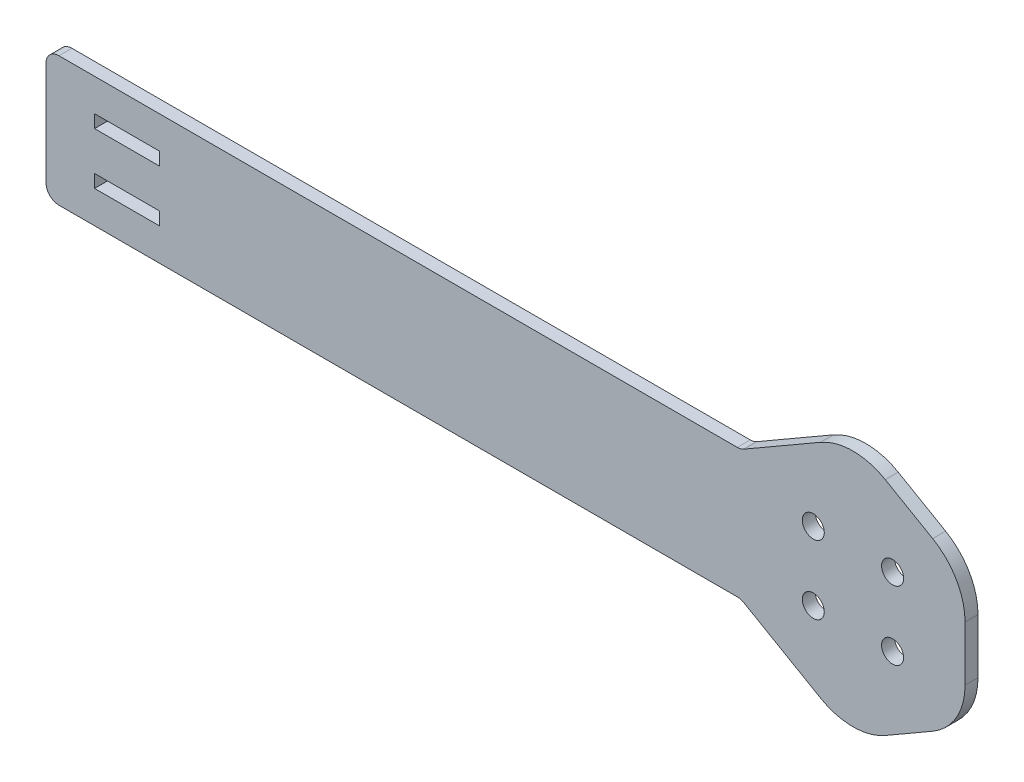
ISO-10303-21;
HEADER;
FILE_DESCRIPTION(('STEP AP214'),'2;1');
FILE_NAME('part.step','',(''),(''),'','','');
FILE_SCHEMA(('AUTOMOTIVE_DESIGN { 1 0 10303 214 1 1 1 1 }'));
ENDSEC;
DATA;
#1=APPLICATION_CONTEXT('core data for automotive mechanical design processes');
#2=APPLICATION_PROTOCOL_DEFINITION('international standard','automotive_design',2000,#1);
#3=PRODUCT_CONTEXT('',#1,'mechanical');
#4=PRODUCT('Part','Part','',(#3));
#5=PRODUCT_RELATED_PRODUCT_CATEGORY('part','',(#4));
#6=PRODUCT_DEFINITION_FORMATION('','',#4);
#7=PRODUCT_DEFINITION_CONTEXT('part definition',#1,'design');
#8=PRODUCT_DEFINITION('design','',#6,#7);
#9=PRODUCT_DEFINITION_SHAPE('','',#8);
#10=(LENGTH_UNIT() NAMED_UNIT(*) SI_UNIT(.MILLI.,.METRE.));
#11=(NAMED_UNIT(*) PLANE_ANGLE_UNIT() SI_UNIT($,.RADIAN.));
#12=(NAMED_UNIT(*) SI_UNIT($,.STERADIAN.) SOLID_ANGLE_UNIT());
#13=UNCERTAINTY_MEASURE_WITH_UNIT(LENGTH_MEASURE(1.E-05),#10,'distance_accuracy_value','');
#14=(GEOMETRIC_REPRESENTATION_CONTEXT(3) GLOBAL_UNCERTAINTY_ASSIGNED_CONTEXT((#13)) GLOBAL_UNIT_ASSIGNED_CONTEXT((#10,
#11,#12)) REPRESENTATION_CONTEXT('',''));
#15=CARTESIAN_POINT('',(0.,0.,0.));
#16=DIRECTION('',(0.,0.,1.));
#17=DIRECTION('',(1.,0.,0.));
#18=AXIS2_PLACEMENT_3D('',#15,#16,#17);
#19=CARTESIAN_POINT('',(-1.16313209064248E-12,-15.0000000000004,2.));
#20=DIRECTION('',(0.,1.,0.));
#21=DIRECTION('',(-1.,0.,0.));
#22=AXIS2_PLACEMENT_3D('',#19,#20,#21);
#23=PLANE('',#22);
#24=DIRECTION('',(1.,0.,0.));
#25=VECTOR('',#24,1.);
#26=CARTESIAN_POINT('',(-1.16313209064248E-12,-15.0000000000004,0.));
#27=LINE('',#26,#25);
#28=CARTESIAN_POINT('',(7.5,-15.000000000001,0.));
#29=VERTEX_POINT('',#28);
#30=CARTESIAN_POINT('',(17.5,-15.0000000000017,0.));
#31=VERTEX_POINT('',#30);
#32=EDGE_CURVE('E275',#29,#31,#27,.T.);
#33=ORIENTED_EDGE('',*,*,#32,.T.);
#34=DIRECTION('',(0.,0.,-1.));
#35=VECTOR('',#34,1.);
#36=CARTESIAN_POINT('',(17.5,-15.0000000000017,2.));
#37=LINE('',#36,#35);
#38=CARTESIAN_POINT('',(17.5,-15.0000000000017,2.));
#39=VERTEX_POINT('',#38);
#40=EDGE_CURVE('E305',#39,#31,#37,.T.);
#41=ORIENTED_EDGE('',*,*,#40,.F.);
#42=DIRECTION('',(1.,0.,0.));
#43=VECTOR('',#42,1.);
#44=CARTESIAN_POINT('',(-1.16313209064248E-12,-15.0000000000004,2.));
#45=LINE('',#44,#43);
#46=CARTESIAN_POINT('',(7.5,-15.000000000001,2.));
#47=VERTEX_POINT('',#46);
#48=EDGE_CURVE('E224',#47,#39,#45,.T.);
#49=ORIENTED_EDGE('',*,*,#48,.F.);
#50=DIRECTION('',(0.,0.,-1.));
#51=VECTOR('',#50,1.);
#52=CARTESIAN_POINT('',(7.5,-15.000000000001,2.));
#53=LINE('',#52,#51);
#54=EDGE_CURVE('E203',#47,#29,#53,.T.);
#55=ORIENTED_EDGE('',*,*,#54,.T.);
#56=EDGE_LOOP('',(#33,#41,#49,#55));
#57=FACE_BOUND('',#56,.T.);
#58=ADVANCED_FACE('F34',(#57),#23,.F.);
#59=CARTESIAN_POINT('',(17.5,0.,2.));
#60=DIRECTION('',(1.,0.,0.));
#61=DIRECTION('',(0.,0.,-1.));
#62=AXIS2_PLACEMENT_3D('',#59,#60,#61);
#63=PLANE('',#62);
#64=DIRECTION('',(0.,-1.,0.));
#65=VECTOR('',#64,1.);
#66=CARTESIAN_POINT('',(17.5,0.,0.));
#67=LINE('',#66,#65);
#68=CARTESIAN_POINT('',(17.5,-17.0000000000017,0.));
#69=VERTEX_POINT('',#68);
#70=EDGE_CURVE('E278',#31,#69,#67,.T.);
#71=ORIENTED_EDGE('',*,*,#70,.T.);
#72=DIRECTION('',(0.,0.,-1.));
#73=VECTOR('',#72,1.);
#74=CARTESIAN_POINT('',(17.5,-17.0000000000017,2.));
#75=LINE('',#74,#73);
#76=CARTESIAN_POINT('',(17.5,-17.0000000000017,2.));
#77=VERTEX_POINT('',#76);
#78=EDGE_CURVE('E303',#77,#69,#75,.T.);
#79=ORIENTED_EDGE('',*,*,#78,.F.);
#80=DIRECTION('',(0.,-1.,0.));
#81=VECTOR('',#80,1.);
#82=CARTESIAN_POINT('',(17.5,0.,2.));
#83=LINE('',#82,#81);
#84=EDGE_CURVE('E227',#39,#77,#83,.T.);
#85=ORIENTED_EDGE('',*,*,#84,.F.);
#86=ORIENTED_EDGE('',*,*,#40,.T.);
#87=EDGE_LOOP('',(#71,#79,#85,#86));
#88=FACE_BOUND('',#87,.T.);
#89=ADVANCED_FACE('F444',(#88),#63,.F.);
#90=CARTESIAN_POINT('',(0.,-17.0000000000018,2.));
#91=DIRECTION('',(0.,1.,0.));
#92=DIRECTION('',(-1.,0.,0.));
#93=AXIS2_PLACEMENT_3D('',#90,#91,#92);
#94=PLANE('',#93);
#95=DIRECTION('',(1.,0.,0.));
#96=VECTOR('',#95,1.);
#97=CARTESIAN_POINT('',(0.,-17.0000000000018,0.));
#98=LINE('',#97,#96);
#99=CARTESIAN_POINT('',(7.5,-17.0000000000017,0.));
#100=VERTEX_POINT('',#99);
#101=EDGE_CURVE('E281',#100,#69,#98,.T.);
#102=ORIENTED_EDGE('',*,*,#101,.F.);
#103=DIRECTION('',(0.,0.,-1.));
#104=VECTOR('',#103,1.);
#105=CARTESIAN_POINT('',(7.5,-17.0000000000017,2.));
#106=LINE('',#105,#104);
#107=CARTESIAN_POINT('',(7.5,-17.0000000000017,2.));
#108=VERTEX_POINT('',#107);
#109=EDGE_CURVE('E301',#108,#100,#106,.T.);
#110=ORIENTED_EDGE('',*,*,#109,.F.);
#111=DIRECTION('',(1.,0.,0.));
#112=VECTOR('',#111,1.);
#113=CARTESIAN_POINT('',(0.,-17.0000000000018,2.));
#114=LINE('',#113,#112);
#115=EDGE_CURVE('E229',#108,#77,#114,.T.);
#116=ORIENTED_EDGE('',*,*,#115,.T.);
#117=ORIENTED_EDGE('',*,*,#78,.T.);
#118=EDGE_LOOP('',(#102,#110,#116,#117));
#119=FACE_BOUND('',#118,.T.);
#120=ADVANCED_FACE('F450',(#119),#94,.T.);
#121=CARTESIAN_POINT('',(17.5,0.,2.));
#122=DIRECTION('',(-1.,0.,0.));
#123=DIRECTION('',(0.,0.,1.));
#124=AXIS2_PLACEMENT_3D('',#121,#122,#123);
#125=PLANE('',#124);
#126=DIRECTION('',(0.,1.,0.));
#127=VECTOR('',#126,1.);
#128=CARTESIAN_POINT('',(17.5,0.,0.));
#129=LINE('',#128,#127);
#130=CARTESIAN_POINT('',(17.5,-25.0000000000017,0.));
#131=VERTEX_POINT('',#130);
#132=CARTESIAN_POINT('',(17.5,-23.0000000000017,0.));
#133=VERTEX_POINT('',#132);
#134=EDGE_CURVE('E198',#131,#133,#129,.T.);
#135=ORIENTED_EDGE('',*,*,#134,.F.);
#136=DIRECTION('',(0.,0.,-1.));
#137=VECTOR('',#136,1.);
#138=CARTESIAN_POINT('',(17.5,-25.0000000000017,2.));
#139=LINE('',#138,#137);
#140=CARTESIAN_POINT('',(17.5,-25.0000000000017,2.));
#141=VERTEX_POINT('',#140);
#142=EDGE_CURVE('E193',#141,#131,#139,.T.);
#143=ORIENTED_EDGE('',*,*,#142,.F.);
#144=DIRECTION('',(0.,1.,0.));
#145=VECTOR('',#144,1.);
#146=CARTESIAN_POINT('',(17.5,0.,2.));
#147=LINE('',#146,#145);
#148=CARTESIAN_POINT('',(17.5,-23.0000000000017,2.));
#149=VERTEX_POINT('',#148);
#150=EDGE_CURVE('E196',#141,#149,#147,.T.);
#151=ORIENTED_EDGE('',*,*,#150,.T.);
#152=DIRECTION('',(0.,0.,-1.));
#153=VECTOR('',#152,1.);
#154=CARTESIAN_POINT('',(17.5,-23.0000000000017,2.));
#155=LINE('',#154,#153);
#156=EDGE_CURVE('E247',#149,#133,#155,.T.);
#157=ORIENTED_EDGE('',*,*,#156,.T.);
#158=EDGE_LOOP('',(#135,#143,#151,#157));
#159=FACE_BOUND('',#158,.T.);
#160=ADVANCED_FACE('F195',(#159),#125,.T.);
#161=CARTESIAN_POINT('',(-1.96023752785382E-12,-25.0000000000004,2.));
#162=DIRECTION('',(0.,1.,0.));
#163=DIRECTION('',(-1.,0.,0.));
#164=AXIS2_PLACEMENT_3D('',#161,#162,#163);
#165=PLANE('',#164);
#166=DIRECTION('',(1.,0.,0.));
#167=VECTOR('',#166,1.);
#168=CARTESIAN_POINT('',(-1.96023752785382E-12,-25.0000000000004,0.));
#169=LINE('',#168,#167);
#170=CARTESIAN_POINT('',(7.5,-25.000000000001,0.));
#171=VERTEX_POINT('',#170);
#172=EDGE_CURVE('E267',#171,#131,#169,.T.);
#173=ORIENTED_EDGE('',*,*,#172,.F.);
#174=DIRECTION('',(0.,0.,-1.));
#175=VECTOR('',#174,1.);
#176=CARTESIAN_POINT('',(7.5,-25.000000000001,2.));
#177=LINE('',#176,#175);
#178=CARTESIAN_POINT('',(7.5,-25.000000000001,2.));
#179=VERTEX_POINT('',#178);
#180=EDGE_CURVE('E204',#179,#171,#177,.T.);
#181=ORIENTED_EDGE('',*,*,#180,.F.);
#182=DIRECTION('',(1.,0.,0.));
#183=VECTOR('',#182,1.);
#184=CARTESIAN_POINT('',(-1.96023752785382E-12,-25.0000000000004,2.));
#185=LINE('',#184,#183);
#186=EDGE_CURVE('E211',#179,#141,#185,.T.);
#187=ORIENTED_EDGE('',*,*,#186,.T.);
#188=ORIENTED_EDGE('',*,*,#142,.T.);
#189=EDGE_LOOP('',(#173,#181,#187,#188));
#190=FACE_BOUND('',#189,.T.);
#191=ADVANCED_FACE('F216',(#190),#165,.T.);
#192=CARTESIAN_POINT('',(7.5,0.,2.));
#193=DIRECTION('',(-1.,0.,0.));
#194=DIRECTION('',(0.,0.,1.));
#195=AXIS2_PLACEMENT_3D('',#192,#193,#194);
#196=PLANE('',#195);
#197=DIRECTION('',(0.,1.,0.));
#198=VECTOR('',#197,1.);
#199=CARTESIAN_POINT('',(7.5,0.,0.));
#200=LINE('',#199,#198);
#201=CARTESIAN_POINT('',(7.5,-23.0000000000017,0.));
#202=VERTEX_POINT('',#201);
#203=EDGE_CURVE('E269',#171,#202,#200,.T.);
#204=ORIENTED_EDGE('',*,*,#203,.T.);
#205=DIRECTION('',(0.,0.,-1.));
#206=VECTOR('',#205,1.);
#207=CARTESIAN_POINT('',(7.5,-23.0000000000017,2.));
#208=LINE('',#207,#206);
#209=CARTESIAN_POINT('',(7.5,-23.0000000000017,2.));
#210=VERTEX_POINT('',#209);
#211=EDGE_CURVE('E310',#210,#202,#208,.T.);
#212=ORIENTED_EDGE('',*,*,#211,.F.);
#213=DIRECTION('',(0.,1.,0.));
#214=VECTOR('',#213,1.);
#215=CARTESIAN_POINT('',(7.5,0.,2.));
#216=LINE('',#215,#214);
#217=EDGE_CURVE('E218',#179,#210,#216,.T.);
#218=ORIENTED_EDGE('',*,*,#217,.F.);
#219=ORIENTED_EDGE('',*,*,#180,.T.);
#220=EDGE_LOOP('',(#204,#212,#218,#219));
#221=FACE_BOUND('',#220,.T.);
#222=ADVANCED_FACE('F461',(#221),#196,.F.);
#223=CARTESIAN_POINT('',(0.,-30.0000000000009,2.));
#224=DIRECTION('',(0.,-1.,0.));
#225=DIRECTION('',(0.,0.,-1.));
#226=AXIS2_PLACEMENT_3D('',#223,#224,#225);
#227=PLANE('',#226);
#228=DIRECTION('',(-1.,0.,0.));
#229=VECTOR('',#228,1.);
#230=CARTESIAN_POINT('',(0.,-30.0000000000009,0.));
#231=LINE('',#230,#229);
#232=CARTESIAN_POINT('',(106.795075065692,-30.0000000000009,0.));
#233=VERTEX_POINT('',#232);
#234=CARTESIAN_POINT('',(2.,-30.0000000000009,0.));
#235=VERTEX_POINT('',#234);
#236=EDGE_CURVE('E248',#233,#235,#231,.T.);
#237=ORIENTED_EDGE('',*,*,#236,.F.);
#238=DIRECTION('',(0.,0.,-1.));
#239=VECTOR('',#238,1.);
#240=CARTESIAN_POINT('',(106.795075065692,-30.0000000000009,2.));
#241=LINE('',#240,#239);
#242=CARTESIAN_POINT('',(106.795075065692,-30.0000000000009,2.));
#243=VERTEX_POINT('',#242);
#244=EDGE_CURVE('E55',#233,#243,#241,.F.);
#245=ORIENTED_EDGE('',*,*,#244,.T.);
#246=DIRECTION('',(-1.,0.,0.));
#247=VECTOR('',#246,1.);
#248=CARTESIAN_POINT('',(0.,-30.0000000000009,2.));
#249=LINE('',#248,#247);
#250=CARTESIAN_POINT('',(2.,-30.0000000000009,2.));
#251=VERTEX_POINT('',#250);
#252=EDGE_CURVE('E299',#243,#251,#249,.T.);
#253=ORIENTED_EDGE('',*,*,#252,.T.);
#254=DIRECTION('',(0.,0.,-1.));
#255=VECTOR('',#254,1.);
#256=CARTESIAN_POINT('',(2.,-30.0000000000009,0.));
#257=LINE('',#256,#255);
#258=EDGE_CURVE('E357',#251,#235,#257,.T.);
#259=ORIENTED_EDGE('',*,*,#258,.T.);
#260=EDGE_LOOP('',(#237,#245,#253,#259));
#261=FACE_BOUND('',#260,.T.);
#262=ADVANCED_FACE('F435',(#261),#227,.T.);
#263=CARTESIAN_POINT('',(13.8423623058709,23.9756748105452,2.));
#264=DIRECTION('',(0.499999999999994,0.866025403784442,0.));
#265=DIRECTION('',(-0.866025403784442,0.499999999999994,0.));
#266=AXIS2_PLACEMENT_3D('',#263,#264,#265);
#267=PLANE('',#266);
#268=DIRECTION('',(0.866025403784442,-0.499999999999994,0.));
#269=VECTOR('',#268,1.);
#270=CARTESIAN_POINT('',(13.8423623058709,23.9756748105452,2.));
#271=LINE('',#270,#269);
#272=CARTESIAN_POINT('',(107.795075065692,-30.267949192432,2.));
#273=VERTEX_POINT('',#272);
#274=CARTESIAN_POINT('',(119.651481526243,-37.113248654053,2.));
#275=VERTEX_POINT('',#274);
#276=EDGE_CURVE('E394',#273,#275,#271,.T.);
#277=ORIENTED_EDGE('',*,*,#276,.F.);
#278=DIRECTION('',(0.,0.,-1.));
#279=VECTOR('',#278,1.);
#280=CARTESIAN_POINT('',(107.795075065692,-30.267949192432,2.));
#281=LINE('',#280,#279);
#282=CARTESIAN_POINT('',(107.795075065692,-30.267949192432,0.));
#283=VERTEX_POINT('',#282);
#284=EDGE_CURVE('E387',#273,#283,#281,.T.);
#285=ORIENTED_EDGE('',*,*,#284,.T.);
#286=DIRECTION('',(0.866025403784442,-0.499999999999994,0.));
#287=VECTOR('',#286,1.);
#288=CARTESIAN_POINT('',(13.8423623058709,23.9756748105452,0.));
#289=LINE('',#288,#287);
#290=CARTESIAN_POINT('',(119.651481526243,-37.113248654053,0.));
#291=VERTEX_POINT('',#290);
#292=EDGE_CURVE('E250',#283,#291,#289,.T.);
#293=ORIENTED_EDGE('',*,*,#292,.T.);
#294=DIRECTION('',(0.,0.,-1.));
#295=VECTOR('',#294,1.);
#296=CARTESIAN_POINT('',(119.651481526243,-37.113248654053,2.));
#297=LINE('',#296,#295);
#298=EDGE_CURVE('E352',#291,#275,#297,.F.);
#299=ORIENTED_EDGE('',*,*,#298,.T.);
#300=EDGE_LOOP('',(#277,#285,#293,#299));
#301=FACE_BOUND('',#300,.T.);
#302=ADVANCED_FACE('F393',(#301),#267,.F.);
#303=CARTESIAN_POINT('',(48.48337845725,-83.9756748105474,2.));
#304=DIRECTION('',(-0.5,0.866025403784439,0.));
#305=DIRECTION('',(-0.866025403784439,-0.5,0.));
#306=AXIS2_PLACEMENT_3D('',#303,#304,#305);
#307=PLANE('',#306);
#308=DIRECTION('',(0.866025403784439,0.5,0.));
#309=VECTOR('',#308,1.);
#310=CARTESIAN_POINT('',(48.48337845725,-83.9756748105474,2.));
#311=LINE('',#310,#309);
#312=CARTESIAN_POINT('',(129.651481526243,-37.1132486540529,2.));
#313=VERTEX_POINT('',#312);
#314=CARTESIAN_POINT('',(136.971989601932,-32.8867513459489,2.));
#315=VERTEX_POINT('',#314);
#316=EDGE_CURVE('E408',#313,#315,#311,.T.);
#317=ORIENTED_EDGE('',*,*,#316,.F.);
#318=DIRECTION('',(0.,0.,-1.));
#319=VECTOR('',#318,1.);
#320=CARTESIAN_POINT('',(129.651481526243,-37.1132486540529,2.));
#321=LINE('',#320,#319);
#322=CARTESIAN_POINT('',(129.651481526243,-37.1132486540529,0.));
#323=VERTEX_POINT('',#322);
#324=EDGE_CURVE('E346',#313,#323,#321,.T.);
#325=ORIENTED_EDGE('',*,*,#324,.T.);
#326=DIRECTION('',(0.866025403784439,0.5,0.));
#327=VECTOR('',#326,1.);
#328=CARTESIAN_POINT('',(48.48337845725,-83.9756748105474,0.));
#329=LINE('',#328,#327);
#330=CARTESIAN_POINT('',(136.971989601932,-32.8867513459489,0.));
#331=VERTEX_POINT('',#330);
#332=EDGE_CURVE('E252',#323,#331,#329,.T.);
#333=ORIENTED_EDGE('',*,*,#332,.T.);
#334=DIRECTION('',(0.,0.,-1.));
#335=VECTOR('',#334,1.);
#336=CARTESIAN_POINT('',(136.971989601932,-32.886751345949,2.));
#337=LINE('',#336,#335);
#338=EDGE_CURVE('E341',#331,#315,#337,.F.);
#339=ORIENTED_EDGE('',*,*,#338,.T.);
#340=EDGE_LOOP('',(#317,#325,#333,#339));
#341=FACE_BOUND('',#340,.T.);
#342=ADVANCED_FACE('F410',(#341),#307,.F.);
#343=CARTESIAN_POINT('',(141.971989601932,9.85128573174394E-13,2.));
#344=DIRECTION('',(-1.,0.,0.));
#345=DIRECTION('',(0.,-1.,0.));
#346=AXIS2_PLACEMENT_3D('',#343,#344,#345);
#347=PLANE('',#346);
#348=DIRECTION('',(0.,1.,0.));
#349=VECTOR('',#348,1.);
#350=CARTESIAN_POINT('',(141.971989601932,9.85128573174394E-13,2.));
#351=LINE('',#350,#349);
#352=CARTESIAN_POINT('',(141.971989601932,-24.2264973081045,2.));
#353=VERTEX_POINT('',#352);
#354=CARTESIAN_POINT('',(141.971989601932,-15.7735026918964,2.));
#355=VERTEX_POINT('',#354);
#356=EDGE_CURVE('E413',#353,#355,#351,.T.);
#357=ORIENTED_EDGE('',*,*,#356,.F.);
#358=DIRECTION('',(0.,0.,-1.));
#359=VECTOR('',#358,1.);
#360=CARTESIAN_POINT('',(141.971989601932,-24.2264973081045,2.));
#361=LINE('',#360,#359);
#362=CARTESIAN_POINT('',(141.971989601932,-24.2264973081045,0.));
#363=VERTEX_POINT('',#362);
#364=EDGE_CURVE('E335',#353,#363,#361,.T.);
#365=ORIENTED_EDGE('',*,*,#364,.T.);
#366=DIRECTION('',(0.,1.,0.));
#367=VECTOR('',#366,1.);
#368=CARTESIAN_POINT('',(141.971989601932,9.85128573174394E-13,0.));
#369=LINE('',#368,#367);
#370=CARTESIAN_POINT('',(141.971989601932,-15.7735026918964,0.));
#371=VERTEX_POINT('',#370);
#372=EDGE_CURVE('E254',#363,#371,#369,.T.);
#373=ORIENTED_EDGE('',*,*,#372,.T.);
#374=DIRECTION('',(0.,0.,-1.));
#375=VECTOR('',#374,1.);
#376=CARTESIAN_POINT('',(141.971989601932,-15.7735026918964,2.));
#377=LINE('',#376,#375);
#378=EDGE_CURVE('E330',#371,#355,#377,.F.);
#379=ORIENTED_EDGE('',*,*,#378,.T.);
#380=EDGE_LOOP('',(#357,#365,#373,#379));
#381=FACE_BOUND('',#380,.T.);
#382=ADVANCED_FACE('F484',(#381),#347,.F.);
#383=CARTESIAN_POINT('',(31.1628703815598,53.975674810546,2.));
#384=DIRECTION('',(-0.499999999999992,-0.866025403784443,0.));
#385=DIRECTION('',(0.866025403784443,-0.499999999999992,0.));
#386=AXIS2_PLACEMENT_3D('',#383,#384,#385);
#387=PLANE('',#386);
#388=DIRECTION('',(-0.866025403784443,0.499999999999992,0.));
#389=VECTOR('',#388,1.);
#390=CARTESIAN_POINT('',(31.1628703815598,53.975674810546,2.));
#391=LINE('',#390,#389);
#392=CARTESIAN_POINT('',(136.971989601932,-7.11324865405202,2.));
#393=VERTEX_POINT('',#392);
#394=CARTESIAN_POINT('',(129.651481526243,-2.88675134594805,2.));
#395=VERTEX_POINT('',#394);
#396=EDGE_CURVE('E415',#393,#395,#391,.T.);
#397=ORIENTED_EDGE('',*,*,#396,.F.);
#398=DIRECTION('',(0.,0.,-1.));
#399=VECTOR('',#398,1.);
#400=CARTESIAN_POINT('',(136.971989601932,-7.113248654052,2.));
#401=LINE('',#400,#399);
#402=CARTESIAN_POINT('',(136.971989601932,-7.11324865405202,0.));
#403=VERTEX_POINT('',#402);
#404=EDGE_CURVE('E324',#393,#403,#401,.T.);
#405=ORIENTED_EDGE('',*,*,#404,.T.);
#406=DIRECTION('',(-0.866025403784443,0.499999999999992,0.));
#407=VECTOR('',#406,1.);
#408=CARTESIAN_POINT('',(31.1628703815598,53.975674810546,0.));
#409=LINE('',#408,#407);
#410=CARTESIAN_POINT('',(129.651481526243,-2.88675134594805,0.));
#411=VERTEX_POINT('',#410);
#412=EDGE_CURVE('E256',#403,#411,#409,.T.);
#413=ORIENTED_EDGE('',*,*,#412,.T.);
#414=DIRECTION('',(0.,0.,-1.));
#415=VECTOR('',#414,1.);
#416=CARTESIAN_POINT('',(129.651481526243,-2.88675134594803,2.));
#417=LINE('',#416,#415);
#418=EDGE_CURVE('E319',#411,#395,#417,.F.);
#419=ORIENTED_EDGE('',*,*,#418,.T.);
#420=EDGE_LOOP('',(#397,#405,#413,#419));
#421=FACE_BOUND('',#420,.T.);
#422=ADVANCED_FACE('F480',(#421),#387,.F.);
#423=CARTESIAN_POINT('',(31.1628703815607,-53.9756748105465,2.));
#424=DIRECTION('',(0.5,-0.866025403784439,0.));
#425=DIRECTION('',(0.866025403784439,0.5,0.));
#426=AXIS2_PLACEMENT_3D('',#423,#424,#425);
#427=PLANE('',#426);
#428=DIRECTION('',(-0.866025403784439,-0.5,0.));
#429=VECTOR('',#428,1.);
#430=CARTESIAN_POINT('',(31.1628703815607,-53.9756748105465,0.));
#431=LINE('',#430,#429);
#432=CARTESIAN_POINT('',(119.651481526243,-2.88675134594808,0.));
#433=VERTEX_POINT('',#432);
#434=CARTESIAN_POINT('',(107.795075065692,-9.73205080756908,0.));
#435=VERTEX_POINT('',#434);
#436=EDGE_CURVE('E258',#433,#435,#431,.T.);
#437=ORIENTED_EDGE('',*,*,#436,.T.);
#438=DIRECTION('',(0.,0.,-1.));
#439=VECTOR('',#438,1.);
#440=CARTESIAN_POINT('',(107.795075065692,-9.73205080756909,2.));
#441=LINE('',#440,#439);
#442=CARTESIAN_POINT('',(107.795075065692,-9.73205080756908,2.));
#443=VERTEX_POINT('',#442);
#444=EDGE_CURVE('E381',#435,#443,#441,.F.);
#445=ORIENTED_EDGE('',*,*,#444,.T.);
#446=DIRECTION('',(-0.866025403784439,-0.5,0.));
#447=VECTOR('',#446,1.);
#448=CARTESIAN_POINT('',(31.1628703815607,-53.9756748105465,2.));
#449=LINE('',#448,#447);
#450=CARTESIAN_POINT('',(119.651481526243,-2.88675134594808,2.));
#451=VERTEX_POINT('',#450);
#452=EDGE_CURVE('E421',#451,#443,#449,.T.);
#453=ORIENTED_EDGE('',*,*,#452,.F.);
#454=DIRECTION('',(0.,0.,-1.));
#455=VECTOR('',#454,1.);
#456=CARTESIAN_POINT('',(119.651481526243,-2.8867513459481,2.));
#457=LINE('',#456,#455);
#458=EDGE_CURVE('E308',#451,#433,#457,.T.);
#459=ORIENTED_EDGE('',*,*,#458,.T.);
#460=EDGE_LOOP('',(#437,#445,#453,#459));
#461=FACE_BOUND('',#460,.T.);
#462=ADVANCED_FACE('F476',(#461),#427,.F.);
#463=CARTESIAN_POINT('',(0.,-10.0000000000004,2.));
#464=DIRECTION('',(0.,-1.,0.));
#465=DIRECTION('',(1.,0.,0.));
#466=AXIS2_PLACEMENT_3D('',#463,#464,#465);
#467=PLANE('',#466);
#468=DIRECTION('',(-1.,0.,0.));
#469=VECTOR('',#468,1.);
#470=CARTESIAN_POINT('',(0.,-10.0000000000004,2.));
#471=LINE('',#470,#469);
#472=CARTESIAN_POINT('',(106.795075065692,-10.0000000000002,2.));
#473=VERTEX_POINT('',#472);
#474=CARTESIAN_POINT('',(2.,-10.0000000000004,2.));
#475=VERTEX_POINT('',#474);
#476=EDGE_CURVE('E424',#473,#475,#471,.T.);
#477=ORIENTED_EDGE('',*,*,#476,.F.);
#478=DIRECTION('',(0.,0.,-1.));
#479=VECTOR('',#478,1.);
#480=CARTESIAN_POINT('',(106.795075065692,-10.0000000000002,0.));
#481=LINE('',#480,#479);
#482=CARTESIAN_POINT('',(106.795075065692,-10.0000000000002,0.));
#483=VERTEX_POINT('',#482);
#484=EDGE_CURVE('E378',#473,#483,#481,.T.);
#485=ORIENTED_EDGE('',*,*,#484,.T.);
#486=DIRECTION('',(-1.,0.,0.));
#487=VECTOR('',#486,1.);
#488=CARTESIAN_POINT('',(0.,-10.0000000000004,0.));
#489=LINE('',#488,#487);
#490=CARTESIAN_POINT('',(2.,-10.0000000000004,0.));
#491=VERTEX_POINT('',#490);
#492=EDGE_CURVE('E261',#483,#491,#489,.T.);
#493=ORIENTED_EDGE('',*,*,#492,.T.);
#494=DIRECTION('',(0.,0.,-1.));
#495=VECTOR('',#494,1.);
#496=CARTESIAN_POINT('',(2.,-10.0000000000004,2.));
#497=LINE('',#496,#495);
#498=EDGE_CURVE('E375',#491,#475,#497,.F.);
#499=ORIENTED_EDGE('',*,*,#498,.T.);
#500=EDGE_LOOP('',(#477,#485,#493,#499));
#501=FACE_BOUND('',#500,.T.);
#502=ADVANCED_FACE('F472',(#501),#467,.F.);
#503=CARTESIAN_POINT('',(130.776481526243,-14.6955944018208,2.));
#504=DIRECTION('',(0.,0.,-1.));
#505=DIRECTION('',(-1.,0.,0.));
#506=AXIS2_PLACEMENT_3D('',#503,#504,#505);
#507=CYLINDRICAL_SURFACE('',#506,1.70000000000001);
#508=CARTESIAN_POINT('',(130.776481526243,-14.6955944018208,2.));
#509=DIRECTION('',(0.,0.,1.));
#510=DIRECTION('',(1.,0.,0.));
#511=AXIS2_PLACEMENT_3D('',#508,#509,#510);
#512=CIRCLE('',#511,1.70000000000001);
#513=CARTESIAN_POINT('',(132.476481526243,-14.6955944018208,2.));
#514=VERTEX_POINT('',#513);
#515=EDGE_CURVE('E241',#514,#514,#512,.T.);
#516=ORIENTED_EDGE('',*,*,#515,.T.);
#517=EDGE_LOOP('',(#516));
#518=FACE_BOUND('',#517,.T.);
#519=CARTESIAN_POINT('',(130.776481526243,-14.6955944018208,0.));
#520=DIRECTION('',(0.,0.,1.));
#521=DIRECTION('',(1.,0.,0.));
#522=AXIS2_PLACEMENT_3D('',#519,#520,#521);
#523=CIRCLE('',#522,1.70000000000001);
#524=CARTESIAN_POINT('',(132.476481526243,-14.6955944018208,0.));
#525=VERTEX_POINT('',#524);
#526=EDGE_CURVE('E293',#525,#525,#523,.T.);
#527=ORIENTED_EDGE('',*,*,#526,.F.);
#528=EDGE_LOOP('',(#527));
#529=FACE_BOUND('',#528,.T.);
#530=ADVANCED_FACE('F475',(#518,#529),#507,.F.);
#531=CARTESIAN_POINT('',(130.776481526243,-25.3044055981802,2.));
#532=DIRECTION('',(0.,0.,-1.));
#533=DIRECTION('',(-1.,0.,0.));
#534=AXIS2_PLACEMENT_3D('',#531,#532,#533);
#535=CYLINDRICAL_SURFACE('',#534,1.70000000000001);
#536=CARTESIAN_POINT('',(130.776481526243,-25.3044055981802,2.));
#537=DIRECTION('',(0.,0.,1.));
#538=DIRECTION('',(1.,0.,0.));
#539=AXIS2_PLACEMENT_3D('',#536,#537,#538);
#540=CIRCLE('',#539,1.70000000000001);
#541=CARTESIAN_POINT('',(132.476481526243,-25.3044055981802,2.));
#542=VERTEX_POINT('',#541);
#543=EDGE_CURVE('E238',#542,#542,#540,.T.);
#544=ORIENTED_EDGE('',*,*,#543,.T.);
#545=EDGE_LOOP('',(#544));
#546=FACE_BOUND('',#545,.T.);
#547=CARTESIAN_POINT('',(130.776481526243,-25.3044055981802,0.));
#548=DIRECTION('',(0.,0.,1.));
#549=DIRECTION('',(1.,0.,0.));
#550=AXIS2_PLACEMENT_3D('',#547,#548,#549);
#551=CIRCLE('',#550,1.70000000000001);
#552=CARTESIAN_POINT('',(132.476481526243,-25.3044055981802,0.));
#553=VERTEX_POINT('',#552);
#554=EDGE_CURVE('E290',#553,#553,#551,.T.);
#555=ORIENTED_EDGE('',*,*,#554,.F.);
#556=EDGE_LOOP('',(#555));
#557=FACE_BOUND('',#556,.T.);
#558=ADVANCED_FACE('F651',(#546,#557),#535,.F.);
#559=CARTESIAN_POINT('',(118.526481526243,-25.3044055981802,2.));
#560=DIRECTION('',(0.,0.,-1.));
#561=DIRECTION('',(-1.,0.,0.));
#562=AXIS2_PLACEMENT_3D('',#559,#560,#561);
#563=CYLINDRICAL_SURFACE('',#562,1.7);
#564=CARTESIAN_POINT('',(118.526481526243,-25.3044055981802,2.));
#565=DIRECTION('',(0.,0.,1.));
#566=DIRECTION('',(1.,0.,0.));
#567=AXIS2_PLACEMENT_3D('',#564,#565,#566);
#568=CIRCLE('',#567,1.7);
#569=CARTESIAN_POINT('',(120.226481526243,-25.3044055981802,2.));
#570=VERTEX_POINT('',#569);
#571=EDGE_CURVE('E235',#570,#570,#568,.T.);
#572=ORIENTED_EDGE('',*,*,#571,.T.);
#573=EDGE_LOOP('',(#572));
#574=FACE_BOUND('',#573,.T.);
#575=CARTESIAN_POINT('',(118.526481526243,-25.3044055981802,0.));
#576=DIRECTION('',(0.,0.,1.));
#577=DIRECTION('',(1.,0.,0.));
#578=AXIS2_PLACEMENT_3D('',#575,#576,#577);
#579=CIRCLE('',#578,1.7);
#580=CARTESIAN_POINT('',(120.226481526243,-25.3044055981802,0.));
#581=VERTEX_POINT('',#580);
#582=EDGE_CURVE('E287',#581,#581,#579,.T.);
#583=ORIENTED_EDGE('',*,*,#582,.F.);
#584=EDGE_LOOP('',(#583));
#585=FACE_BOUND('',#584,.T.);
#586=ADVANCED_FACE('F641',(#574,#585),#563,.F.);
#587=CARTESIAN_POINT('',(7.5,0.,2.));
#588=DIRECTION('',(1.,0.,0.));
#589=DIRECTION('',(0.,0.,-1.));
#590=AXIS2_PLACEMENT_3D('',#587,#588,#589);
#591=PLANE('',#590);
#592=DIRECTION('',(0.,-1.,0.));
#593=VECTOR('',#592,1.);
#594=CARTESIAN_POINT('',(7.5,0.,0.));
#595=LINE('',#594,#593);
#596=EDGE_CURVE('E284',#29,#100,#595,.T.);
#597=ORIENTED_EDGE('',*,*,#596,.F.);
#598=ORIENTED_EDGE('',*,*,#54,.F.);
#599=DIRECTION('',(0.,-1.,0.));
#600=VECTOR('',#599,1.);
#601=CARTESIAN_POINT('',(7.5,0.,2.));
#602=LINE('',#601,#600);
#603=EDGE_CURVE('E232',#47,#108,#602,.T.);
#604=ORIENTED_EDGE('',*,*,#603,.T.);
#605=ORIENTED_EDGE('',*,*,#109,.T.);
#606=EDGE_LOOP('',(#597,#598,#604,#605));
#607=FACE_BOUND('',#606,.T.);
#608=ADVANCED_FACE('F459',(#607),#591,.T.);
#609=CARTESIAN_POINT('',(0.,-23.0000000000017,2.));
#610=DIRECTION('',(0.,1.,0.));
#611=DIRECTION('',(0.,0.,1.));
#612=AXIS2_PLACEMENT_3D('',#609,#610,#611);
#613=PLANE('',#612);
#614=DIRECTION('',(1.,0.,0.));
#615=VECTOR('',#614,1.);
#616=CARTESIAN_POINT('',(0.,-23.0000000000017,0.));
#617=LINE('',#616,#615);
#618=EDGE_CURVE('E272',#202,#133,#617,.T.);
#619=ORIENTED_EDGE('',*,*,#618,.T.);
#620=ORIENTED_EDGE('',*,*,#156,.F.);
#621=DIRECTION('',(1.,0.,0.));
#622=VECTOR('',#621,1.);
#623=CARTESIAN_POINT('',(0.,-23.0000000000017,2.));
#624=LINE('',#623,#622);
#625=EDGE_CURVE('E212',#210,#149,#624,.T.);
#626=ORIENTED_EDGE('',*,*,#625,.F.);
#627=ORIENTED_EDGE('',*,*,#211,.T.);
#628=EDGE_LOOP('',(#619,#620,#626,#627));
#629=FACE_BOUND('',#628,.T.);
#630=ADVANCED_FACE('F455',(#629),#613,.F.);
#631=CARTESIAN_POINT('',(0.,0.,2.));
#632=DIRECTION('',(1.,0.,0.));
#633=DIRECTION('',(0.,1.,0.));
#634=AXIS2_PLACEMENT_3D('',#631,#632,#633);
#635=PLANE('',#634);
#636=DIRECTION('',(0.,-1.,0.));
#637=VECTOR('',#636,1.);
#638=CARTESIAN_POINT('',(0.,0.,0.));
#639=LINE('',#638,#637);
#640=CARTESIAN_POINT('',(0.,-12.0000000000004,0.));
#641=VERTEX_POINT('',#640);
#642=CARTESIAN_POINT('',(0.,-28.0000000000009,0.));
#643=VERTEX_POINT('',#642);
#644=EDGE_CURVE('E263',#641,#643,#639,.T.);
#645=ORIENTED_EDGE('',*,*,#644,.T.);
#646=DIRECTION('',(0.,0.,-1.));
#647=VECTOR('',#646,1.);
#648=CARTESIAN_POINT('',(0.,-28.0000000000009,2.));
#649=LINE('',#648,#647);
#650=CARTESIAN_POINT('',(0.,-28.0000000000009,2.));
#651=VERTEX_POINT('',#650);
#652=EDGE_CURVE('E368',#643,#651,#649,.F.);
#653=ORIENTED_EDGE('',*,*,#652,.T.);
#654=DIRECTION('',(0.,-1.,0.));
#655=VECTOR('',#654,1.);
#656=CARTESIAN_POINT('',(0.,0.,2.));
#657=LINE('',#656,#655);
#658=CARTESIAN_POINT('',(0.,-12.0000000000004,2.));
#659=VERTEX_POINT('',#658);
#660=EDGE_CURVE('E214',#659,#651,#657,.T.);
#661=ORIENTED_EDGE('',*,*,#660,.F.);
#662=DIRECTION('',(0.,0.,-1.));
#663=VECTOR('',#662,1.);
#664=CARTESIAN_POINT('',(0.,-12.0000000000004,2.));
#665=LINE('',#664,#663);
#666=EDGE_CURVE('E365',#659,#641,#665,.T.);
#667=ORIENTED_EDGE('',*,*,#666,.T.);
#668=EDGE_LOOP('',(#645,#653,#661,#667));
#669=FACE_BOUND('',#668,.T.);
#670=ADVANCED_FACE('F458',(#669),#635,.F.);
#671=CARTESIAN_POINT('',(118.526481526243,-14.6955944018208,2.));
#672=DIRECTION('',(0.,0.,-1.));
#673=DIRECTION('',(-1.,0.,0.));
#674=AXIS2_PLACEMENT_3D('',#671,#672,#673);
#675=CYLINDRICAL_SURFACE('',#674,1.7);
#676=CARTESIAN_POINT('',(118.526481526243,-14.6955944018208,2.));
#677=DIRECTION('',(0.,0.,1.));
#678=DIRECTION('',(1.,0.,0.));
#679=AXIS2_PLACEMENT_3D('',#676,#677,#678);
#680=CIRCLE('',#679,1.7);
#681=CARTESIAN_POINT('',(120.226481526243,-14.6955944018208,2.));
#682=VERTEX_POINT('',#681);
#683=EDGE_CURVE('E244',#682,#682,#680,.T.);
#684=ORIENTED_EDGE('',*,*,#683,.T.);
#685=EDGE_LOOP('',(#684));
#686=FACE_BOUND('',#685,.T.);
#687=CARTESIAN_POINT('',(118.526481526243,-14.6955944018208,0.));
#688=DIRECTION('',(0.,0.,1.));
#689=DIRECTION('',(1.,0.,0.));
#690=AXIS2_PLACEMENT_3D('',#687,#688,#689);
#691=CIRCLE('',#690,1.7);
#692=CARTESIAN_POINT('',(120.226481526243,-14.6955944018208,0.));
#693=VERTEX_POINT('',#692);
#694=EDGE_CURVE('E296',#693,#693,#691,.T.);
#695=ORIENTED_EDGE('',*,*,#694,.F.);
#696=EDGE_LOOP('',(#695));
#697=FACE_BOUND('',#696,.T.);
#698=ADVANCED_FACE('F471',(#686,#697),#675,.F.);
#699=CARTESIAN_POINT('',(0.,0.,2.));
#700=DIRECTION('',(0.,0.,1.));
#701=DIRECTION('',(1.,0.,0.));
#702=AXIS2_PLACEMENT_3D('',#699,#700,#701);
#703=PLANE('',#702);
#704=ORIENTED_EDGE('',*,*,#660,.T.);
#705=CARTESIAN_POINT('',(2.,-28.0000000000009,2.));
#706=DIRECTION('',(0.,0.,1.));
#707=DIRECTION('',(1.,0.,0.));
#708=AXIS2_PLACEMENT_3D('',#705,#706,#707);
#709=CIRCLE('',#708,2.);
#710=EDGE_CURVE('E372',#651,#251,#709,.T.);
#711=ORIENTED_EDGE('',*,*,#710,.T.);
#712=ORIENTED_EDGE('',*,*,#252,.F.);
#713=CARTESIAN_POINT('',(106.795075065692,-32.0000000000009,2.));
#714=DIRECTION('',(0.,0.,1.));
#715=DIRECTION('',(1.,0.,0.));
#716=AXIS2_PLACEMENT_3D('',#713,#714,#715);
#717=CIRCLE('',#716,2.);
#718=EDGE_CURVE('E11',#243,#273,#717,.F.);
#719=ORIENTED_EDGE('',*,*,#718,.T.);
#720=ORIENTED_EDGE('',*,*,#276,.T.);
#721=CARTESIAN_POINT('',(124.651481526243,-28.4529946162085,2.));
#722=DIRECTION('',(0.,0.,1.));
#723=DIRECTION('',(1.,0.,0.));
#724=AXIS2_PLACEMENT_3D('',#721,#722,#723);
#725=CIRCLE('',#724,10.);
#726=EDGE_CURVE('E355',#275,#313,#725,.T.);
#727=ORIENTED_EDGE('',*,*,#726,.T.);
#728=ORIENTED_EDGE('',*,*,#316,.T.);
#729=CARTESIAN_POINT('',(131.971989601932,-24.2264973081046,2.));
#730=DIRECTION('',(0.,0.,1.));
#731=DIRECTION('',(1.,0.,0.));
#732=AXIS2_PLACEMENT_3D('',#729,#730,#731);
#733=CIRCLE('',#732,10.);
#734=EDGE_CURVE('E344',#315,#353,#733,.T.);
#735=ORIENTED_EDGE('',*,*,#734,.T.);
#736=ORIENTED_EDGE('',*,*,#356,.T.);
#737=CARTESIAN_POINT('',(131.971989601932,-15.7735026918964,2.));
#738=DIRECTION('',(0.,0.,1.));
#739=DIRECTION('',(1.,0.,0.));
#740=AXIS2_PLACEMENT_3D('',#737,#738,#739);
#741=CIRCLE('',#740,10.);
#742=EDGE_CURVE('E333',#355,#393,#741,.T.);
#743=ORIENTED_EDGE('',*,*,#742,.T.);
#744=ORIENTED_EDGE('',*,*,#396,.T.);
#745=CARTESIAN_POINT('',(124.651481526243,-11.5470053837925,2.));
#746=DIRECTION('',(0.,0.,1.));
#747=DIRECTION('',(1.,0.,0.));
#748=AXIS2_PLACEMENT_3D('',#745,#746,#747);
#749=CIRCLE('',#748,10.);
#750=EDGE_CURVE('E322',#395,#451,#749,.T.);
#751=ORIENTED_EDGE('',*,*,#750,.T.);
#752=ORIENTED_EDGE('',*,*,#452,.T.);
#753=CARTESIAN_POINT('',(106.795075065692,-8.00000000000021,2.));
#754=DIRECTION('',(0.,0.,1.));
#755=DIRECTION('',(1.,0.,0.));
#756=AXIS2_PLACEMENT_3D('',#753,#754,#755);
#757=CIRCLE('',#756,2.);
#758=EDGE_CURVE('E385',#443,#473,#757,.F.);
#759=ORIENTED_EDGE('',*,*,#758,.T.);
#760=ORIENTED_EDGE('',*,*,#476,.T.);
#761=CARTESIAN_POINT('',(2.,-12.0000000000004,2.));
#762=DIRECTION('',(0.,0.,1.));
#763=DIRECTION('',(1.,0.,0.));
#764=AXIS2_PLACEMENT_3D('',#761,#762,#763);
#765=CIRCLE('',#764,2.);
#766=EDGE_CURVE('E370',#475,#659,#765,.T.);
#767=ORIENTED_EDGE('',*,*,#766,.T.);
#768=EDGE_LOOP('',(#704,#711,#712,#719,#720,#727,#728,#735,#736,#743,#744,#751,#752,#759,#760,#767));
#769=FACE_BOUND('',#768,.T.);
#770=ORIENTED_EDGE('',*,*,#150,.F.);
#771=ORIENTED_EDGE('',*,*,#186,.F.);
#772=ORIENTED_EDGE('',*,*,#217,.T.);
#773=ORIENTED_EDGE('',*,*,#625,.T.);
#774=EDGE_LOOP('',(#770,#771,#772,#773));
#775=FACE_BOUND('',#774,.T.);
#776=ORIENTED_EDGE('',*,*,#48,.T.);
#777=ORIENTED_EDGE('',*,*,#84,.T.);
#778=ORIENTED_EDGE('',*,*,#115,.F.);
#779=ORIENTED_EDGE('',*,*,#603,.F.);
#780=EDGE_LOOP('',(#776,#777,#778,#779));
#781=FACE_BOUND('',#780,.T.);
#782=ORIENTED_EDGE('',*,*,#571,.F.);
#783=EDGE_LOOP('',(#782));
#784=FACE_BOUND('',#783,.T.);
#785=ORIENTED_EDGE('',*,*,#543,.F.);
#786=EDGE_LOOP('',(#785));
#787=FACE_BOUND('',#786,.T.);
#788=ORIENTED_EDGE('',*,*,#515,.F.);
#789=EDGE_LOOP('',(#788));
#790=FACE_BOUND('',#789,.T.);
#791=ORIENTED_EDGE('',*,*,#683,.F.);
#792=EDGE_LOOP('',(#791));
#793=FACE_BOUND('',#792,.T.);
#794=ADVANCED_FACE('F208',(#769,#775,#781,#784,#787,#790,#793),#703,.T.);
#795=CARTESIAN_POINT('',(0.,0.,0.));
#796=DIRECTION('',(0.,0.,1.));
#797=DIRECTION('',(1.,0.,0.));
#798=AXIS2_PLACEMENT_3D('',#795,#796,#797);
#799=PLANE('',#798);
#800=ORIENTED_EDGE('',*,*,#292,.F.);
#801=CARTESIAN_POINT('',(106.795075065692,-32.0000000000009,0.));
#802=DIRECTION('',(0.,0.,1.));
#803=DIRECTION('',(1.,0.,0.));
#804=AXIS2_PLACEMENT_3D('',#801,#802,#803);
#805=CIRCLE('',#804,2.);
#806=EDGE_CURVE('E42',#283,#233,#805,.T.);
#807=ORIENTED_EDGE('',*,*,#806,.T.);
#808=ORIENTED_EDGE('',*,*,#236,.T.);
#809=CARTESIAN_POINT('',(2.,-28.0000000000009,0.));
#810=DIRECTION('',(0.,0.,1.));
#811=DIRECTION('',(1.,0.,0.));
#812=AXIS2_PLACEMENT_3D('',#809,#810,#811);
#813=CIRCLE('',#812,2.);
#814=EDGE_CURVE('E363',#235,#643,#813,.F.);
#815=ORIENTED_EDGE('',*,*,#814,.T.);
#816=ORIENTED_EDGE('',*,*,#644,.F.);
#817=CARTESIAN_POINT('',(2.,-12.0000000000004,0.));
#818=DIRECTION('',(0.,0.,1.));
#819=DIRECTION('',(1.,0.,0.));
#820=AXIS2_PLACEMENT_3D('',#817,#818,#819);
#821=CIRCLE('',#820,2.);
#822=EDGE_CURVE('E360',#641,#491,#821,.F.);
#823=ORIENTED_EDGE('',*,*,#822,.T.);
#824=ORIENTED_EDGE('',*,*,#492,.F.);
#825=CARTESIAN_POINT('',(106.795075065692,-8.00000000000021,0.));
#826=DIRECTION('',(0.,0.,1.));
#827=DIRECTION('',(1.,0.,0.));
#828=AXIS2_PLACEMENT_3D('',#825,#826,#827);
#829=CIRCLE('',#828,2.);
#830=EDGE_CURVE('E383',#483,#435,#829,.T.);
#831=ORIENTED_EDGE('',*,*,#830,.T.);
#832=ORIENTED_EDGE('',*,*,#436,.F.);
#833=CARTESIAN_POINT('',(124.651481526243,-11.5470053837925,0.));
#834=DIRECTION('',(0.,0.,1.));
#835=DIRECTION('',(1.,0.,0.));
#836=AXIS2_PLACEMENT_3D('',#833,#834,#835);
#837=CIRCLE('',#836,10.);
#838=EDGE_CURVE('E316',#433,#411,#837,.F.);
#839=ORIENTED_EDGE('',*,*,#838,.T.);
#840=ORIENTED_EDGE('',*,*,#412,.F.);
#841=CARTESIAN_POINT('',(131.971989601932,-15.7735026918964,0.));
#842=DIRECTION('',(0.,0.,1.));
#843=DIRECTION('',(1.,0.,0.));
#844=AXIS2_PLACEMENT_3D('',#841,#842,#843);
#845=CIRCLE('',#844,10.);
#846=EDGE_CURVE('E327',#403,#371,#845,.F.);
#847=ORIENTED_EDGE('',*,*,#846,.T.);
#848=ORIENTED_EDGE('',*,*,#372,.F.);
#849=CARTESIAN_POINT('',(131.971989601932,-24.2264973081046,0.));
#850=DIRECTION('',(0.,0.,1.));
#851=DIRECTION('',(1.,0.,0.));
#852=AXIS2_PLACEMENT_3D('',#849,#850,#851);
#853=CIRCLE('',#852,10.);
#854=EDGE_CURVE('E338',#363,#331,#853,.F.);
#855=ORIENTED_EDGE('',*,*,#854,.T.);
#856=ORIENTED_EDGE('',*,*,#332,.F.);
#857=CARTESIAN_POINT('',(124.651481526243,-28.4529946162085,0.));
#858=DIRECTION('',(0.,0.,1.));
#859=DIRECTION('',(1.,0.,0.));
#860=AXIS2_PLACEMENT_3D('',#857,#858,#859);
#861=CIRCLE('',#860,10.);
#862=EDGE_CURVE('E349',#323,#291,#861,.F.);
#863=ORIENTED_EDGE('',*,*,#862,.T.);
#864=EDGE_LOOP('',(#800,#807,#808,#815,#816,#823,#824,#831,#832,#839,#840,#847,#848,#855,#856,#863));
#865=FACE_BOUND('',#864,.T.);
#866=ORIENTED_EDGE('',*,*,#134,.T.);
#867=ORIENTED_EDGE('',*,*,#618,.F.);
#868=ORIENTED_EDGE('',*,*,#203,.F.);
#869=ORIENTED_EDGE('',*,*,#172,.T.);
#870=EDGE_LOOP('',(#866,#867,#868,#869));
#871=FACE_BOUND('',#870,.T.);
#872=ORIENTED_EDGE('',*,*,#32,.F.);
#873=ORIENTED_EDGE('',*,*,#596,.T.);
#874=ORIENTED_EDGE('',*,*,#101,.T.);
#875=ORIENTED_EDGE('',*,*,#70,.F.);
#876=EDGE_LOOP('',(#872,#873,#874,#875));
#877=FACE_BOUND('',#876,.T.);
#878=ORIENTED_EDGE('',*,*,#582,.T.);
#879=EDGE_LOOP('',(#878));
#880=FACE_BOUND('',#879,.T.);
#881=ORIENTED_EDGE('',*,*,#554,.T.);
#882=EDGE_LOOP('',(#881));
#883=FACE_BOUND('',#882,.T.);
#884=ORIENTED_EDGE('',*,*,#526,.T.);
#885=EDGE_LOOP('',(#884));
#886=FACE_BOUND('',#885,.T.);
#887=ORIENTED_EDGE('',*,*,#694,.T.);
#888=EDGE_LOOP('',(#887));
#889=FACE_BOUND('',#888,.T.);
#890=ADVANCED_FACE('F397',(#865,#871,#877,#880,#883,#886,#889),#799,.F.);
#891=CARTESIAN_POINT('',(124.651481526243,-11.5470053837925,2.));
#892=DIRECTION('',(0.,0.,-1.));
#893=DIRECTION('',(-1.,0.,0.));
#894=AXIS2_PLACEMENT_3D('',#891,#892,#893);
#895=CYLINDRICAL_SURFACE('',#894,10.);
#896=ORIENTED_EDGE('',*,*,#750,.F.);
#897=ORIENTED_EDGE('',*,*,#418,.F.);
#898=ORIENTED_EDGE('',*,*,#838,.F.);
#899=ORIENTED_EDGE('',*,*,#458,.F.);
#900=EDGE_LOOP('',(#896,#897,#898,#899));
#901=FACE_BOUND('',#900,.T.);
#902=ADVANCED_FACE('F495',(#901),#895,.T.);
#903=CARTESIAN_POINT('',(131.971989601932,-15.7735026918964,2.));
#904=DIRECTION('',(0.,0.,-1.));
#905=DIRECTION('',(-1.,0.,0.));
#906=AXIS2_PLACEMENT_3D('',#903,#904,#905);
#907=CYLINDRICAL_SURFACE('',#906,10.);
#908=ORIENTED_EDGE('',*,*,#742,.F.);
#909=ORIENTED_EDGE('',*,*,#378,.F.);
#910=ORIENTED_EDGE('',*,*,#846,.F.);
#911=ORIENTED_EDGE('',*,*,#404,.F.);
#912=EDGE_LOOP('',(#908,#909,#910,#911));
#913=FACE_BOUND('',#912,.T.);
#914=ADVANCED_FACE('F498',(#913),#907,.T.);
#915=CARTESIAN_POINT('',(131.971989601932,-24.2264973081046,2.));
#916=DIRECTION('',(0.,0.,-1.));
#917=DIRECTION('',(-1.,0.,0.));
#918=AXIS2_PLACEMENT_3D('',#915,#916,#917);
#919=CYLINDRICAL_SURFACE('',#918,10.);
#920=ORIENTED_EDGE('',*,*,#734,.F.);
#921=ORIENTED_EDGE('',*,*,#338,.F.);
#922=ORIENTED_EDGE('',*,*,#854,.F.);
#923=ORIENTED_EDGE('',*,*,#364,.F.);
#924=EDGE_LOOP('',(#920,#921,#922,#923));
#925=FACE_BOUND('',#924,.T.);
#926=ADVANCED_FACE('F502',(#925),#919,.T.);
#927=CARTESIAN_POINT('',(124.651481526243,-28.4529946162085,2.));
#928=DIRECTION('',(0.,0.,-1.));
#929=DIRECTION('',(-1.,0.,0.));
#930=AXIS2_PLACEMENT_3D('',#927,#928,#929);
#931=CYLINDRICAL_SURFACE('',#930,10.);
#932=ORIENTED_EDGE('',*,*,#726,.F.);
#933=ORIENTED_EDGE('',*,*,#298,.F.);
#934=ORIENTED_EDGE('',*,*,#862,.F.);
#935=ORIENTED_EDGE('',*,*,#324,.F.);
#936=EDGE_LOOP('',(#932,#933,#934,#935));
#937=FACE_BOUND('',#936,.T.);
#938=ADVANCED_FACE('F404',(#937),#931,.T.);
#939=CARTESIAN_POINT('',(2.,-28.0000000000009,2.));
#940=DIRECTION('',(0.,0.,1.));
#941=DIRECTION('',(1.,0.,0.));
#942=AXIS2_PLACEMENT_3D('',#939,#940,#941);
#943=CYLINDRICAL_SURFACE('',#942,2.);
#944=ORIENTED_EDGE('',*,*,#710,.F.);
#945=ORIENTED_EDGE('',*,*,#652,.F.);
#946=ORIENTED_EDGE('',*,*,#814,.F.);
#947=ORIENTED_EDGE('',*,*,#258,.F.);
#948=EDGE_LOOP('',(#944,#945,#946,#947));
#949=FACE_BOUND('',#948,.T.);
#950=ADVANCED_FACE('F433',(#949),#943,.T.);
#951=CARTESIAN_POINT('',(2.,-12.0000000000004,2.));
#952=DIRECTION('',(0.,0.,-1.));
#953=DIRECTION('',(-1.,0.,0.));
#954=AXIS2_PLACEMENT_3D('',#951,#952,#953);
#955=CYLINDRICAL_SURFACE('',#954,2.);
#956=ORIENTED_EDGE('',*,*,#766,.F.);
#957=ORIENTED_EDGE('',*,*,#498,.F.);
#958=ORIENTED_EDGE('',*,*,#822,.F.);
#959=ORIENTED_EDGE('',*,*,#666,.F.);
#960=EDGE_LOOP('',(#956,#957,#958,#959));
#961=FACE_BOUND('',#960,.T.);
#962=ADVANCED_FACE('F441',(#961),#955,.T.);
#963=CARTESIAN_POINT('',(106.795075065692,-8.00000000000021,2.));
#964=DIRECTION('',(0.,0.,1.));
#965=DIRECTION('',(1.,0.,0.));
#966=AXIS2_PLACEMENT_3D('',#963,#964,#965);
#967=CYLINDRICAL_SURFACE('',#966,2.);
#968=ORIENTED_EDGE('',*,*,#758,.F.);
#969=ORIENTED_EDGE('',*,*,#444,.F.);
#970=ORIENTED_EDGE('',*,*,#830,.F.);
#971=ORIENTED_EDGE('',*,*,#484,.F.);
#972=EDGE_LOOP('',(#968,#969,#970,#971));
#973=FACE_BOUND('',#972,.T.);
#974=ADVANCED_FACE('F437',(#973),#967,.F.);
#975=CARTESIAN_POINT('',(106.795075065692,-32.0000000000009,2.));
#976=DIRECTION('',(0.,0.,-1.));
#977=DIRECTION('',(-1.,0.,0.));
#978=AXIS2_PLACEMENT_3D('',#975,#976,#977);
#979=CYLINDRICAL_SURFACE('',#978,2.);
#980=ORIENTED_EDGE('',*,*,#718,.F.);
#981=ORIENTED_EDGE('',*,*,#244,.F.);
#982=ORIENTED_EDGE('',*,*,#806,.F.);
#983=ORIENTED_EDGE('',*,*,#284,.F.);
#984=EDGE_LOOP('',(#980,#981,#982,#983));
#985=FACE_BOUND('',#984,.T.);
#986=ADVANCED_FACE('F36',(#985),#979,.F.);
#987=CLOSED_SHELL('',(#58,#89,#120,#160,#191,#222,#262,#302,#342,#382,#422,#462,#502,#530,#558,
#586,#608,#630,#670,#698,#794,#890,#902,#914,#926,#938,#950,#962,#974,#986));
#988=MANIFOLD_SOLID_BREP('B2',#987);
#989=ADVANCED_BREP_SHAPE_REPRESENTATION('',(#18,#988),#14);
#990=SHAPE_DEFINITION_REPRESENTATION(#9,#989);
ENDSEC;
END-ISO-10303-21;
